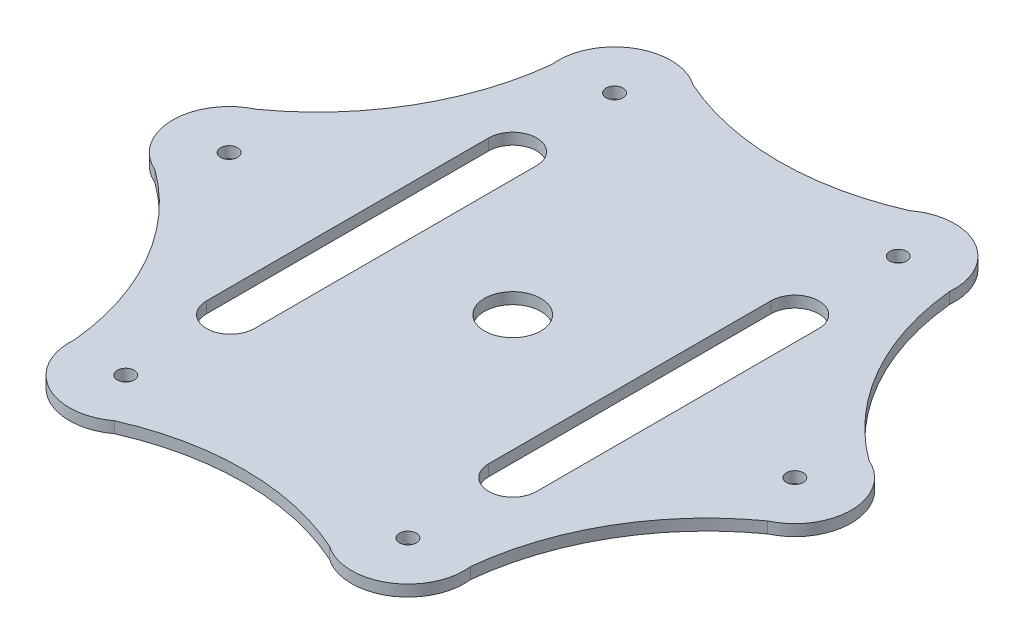
ISO-10303-21;
HEADER;
FILE_DESCRIPTION(('STEP AP214'),'2;1');
FILE_NAME('part.step','',(''),(''),'','','');
FILE_SCHEMA(('AUTOMOTIVE_DESIGN { 1 0 10303 214 1 1 1 1 }'));
ENDSEC;
DATA;
#1=APPLICATION_CONTEXT('core data for automotive mechanical design processes');
#2=APPLICATION_PROTOCOL_DEFINITION('international standard','automotive_design',2000,#1);
#3=PRODUCT_CONTEXT('',#1,'mechanical');
#4=PRODUCT('Part','Part','',(#3));
#5=PRODUCT_RELATED_PRODUCT_CATEGORY('part','',(#4));
#6=PRODUCT_DEFINITION_FORMATION('','',#4);
#7=PRODUCT_DEFINITION_CONTEXT('part definition',#1,'design');
#8=PRODUCT_DEFINITION('design','',#6,#7);
#9=PRODUCT_DEFINITION_SHAPE('','',#8);
#10=(LENGTH_UNIT() NAMED_UNIT(*) SI_UNIT(.MILLI.,.METRE.));
#11=(NAMED_UNIT(*) PLANE_ANGLE_UNIT() SI_UNIT($,.RADIAN.));
#12=(NAMED_UNIT(*) SI_UNIT($,.STERADIAN.) SOLID_ANGLE_UNIT());
#13=UNCERTAINTY_MEASURE_WITH_UNIT(LENGTH_MEASURE(1.E-05),#10,'distance_accuracy_value','');
#14=(GEOMETRIC_REPRESENTATION_CONTEXT(3) GLOBAL_UNCERTAINTY_ASSIGNED_CONTEXT((#13)) GLOBAL_UNIT_ASSIGNED_CONTEXT((#10,
#11,#12)) REPRESENTATION_CONTEXT('',''));
#15=CARTESIAN_POINT('',(0.,0.,0.));
#16=DIRECTION('',(0.,0.,1.));
#17=DIRECTION('',(1.,0.,0.));
#18=AXIS2_PLACEMENT_3D('',#15,#16,#17);
#19=CARTESIAN_POINT('',(-81.6112480416891,-2.,47.2721043024421));
#20=DIRECTION('',(0.,1.,0.));
#21=DIRECTION('',(0.,0.,1.));
#22=AXIS2_PLACEMENT_3D('',#19,#20,#21);
#23=CYLINDRICAL_SURFACE('',#22,46.8718791369647);
#24=CARTESIAN_POINT('',(-81.6112480416891,0.,47.2721043024421));
#25=DIRECTION('',(0.,-1.,0.));
#26=DIRECTION('',(0.,0.,-1.));
#27=AXIS2_PLACEMENT_3D('',#24,#25,#26);
#28=CIRCLE('',#27,46.8718791369647);
#29=CARTESIAN_POINT('',(-53.9349465475384,0.,9.44360460399912));
#30=VERTEX_POINT('',#29);
#31=CARTESIAN_POINT('',(-34.96376395523,0.,42.6911347288935));
#32=VERTEX_POINT('',#31);
#33=EDGE_CURVE('E278',#30,#32,#28,.T.);
#34=ORIENTED_EDGE('',*,*,#33,.F.);
#35=DIRECTION('',(0.,1.,0.));
#36=VECTOR('',#35,1.);
#37=CARTESIAN_POINT('',(-53.9349465475384,-2.,9.44360460399912));
#38=LINE('',#37,#36);
#39=CARTESIAN_POINT('',(-53.9349465475384,-2.,9.44360460399912));
#40=VERTEX_POINT('',#39);
#41=EDGE_CURVE('E11',#40,#30,#38,.T.);
#42=ORIENTED_EDGE('',*,*,#41,.F.);
#43=CARTESIAN_POINT('',(-81.6112480416891,-2.,47.2721043024421));
#44=DIRECTION('',(0.,-1.,0.));
#45=DIRECTION('',(0.,0.,-1.));
#46=AXIS2_PLACEMENT_3D('',#43,#44,#45);
#47=CIRCLE('',#46,46.8718791369647);
#48=CARTESIAN_POINT('',(-34.96376395523,-2.,42.6911347288935));
#49=VERTEX_POINT('',#48);
#50=EDGE_CURVE('E281',#40,#49,#47,.T.);
#51=ORIENTED_EDGE('',*,*,#50,.T.);
#52=DIRECTION('',(0.,1.,0.));
#53=VECTOR('',#52,1.);
#54=CARTESIAN_POINT('',(-34.96376395523,-2.,42.6911347288935));
#55=LINE('',#54,#53);
#56=EDGE_CURVE('E36',#49,#32,#55,.T.);
#57=ORIENTED_EDGE('',*,*,#56,.T.);
#58=EDGE_LOOP('',(#34,#42,#51,#57));
#59=FACE_BOUND('',#58,.T.);
#60=ADVANCED_FACE('F33',(#59),#23,.F.);
#61=CARTESIAN_POINT('',(-50.0008228466353,-2.,0.24998340743068));
#62=DIRECTION('',(0.,1.,0.));
#63=DIRECTION('',(0.,0.,1.));
#64=AXIS2_PLACEMENT_3D('',#61,#62,#63);
#65=CYLINDRICAL_SURFACE('',#64,10.);
#66=CARTESIAN_POINT('',(-50.0008228466353,0.,0.24998340743068));
#67=DIRECTION('',(0.,1.,0.));
#68=DIRECTION('',(0.,0.,1.));
#69=AXIS2_PLACEMENT_3D('',#66,#67,#68);
#70=CIRCLE('',#69,10.);
#71=CARTESIAN_POINT('',(-54.2374086111789,0.,-8.80823612290015));
#72=VERTEX_POINT('',#71);
#73=EDGE_CURVE('E285',#72,#30,#70,.T.);
#74=ORIENTED_EDGE('',*,*,#73,.F.);
#75=DIRECTION('',(0.,1.,0.));
#76=VECTOR('',#75,1.);
#77=CARTESIAN_POINT('',(-54.2374086111789,-2.,-8.80823612290015));
#78=LINE('',#77,#76);
#79=CARTESIAN_POINT('',(-54.2374086111789,-2.,-8.80823612290015));
#80=VERTEX_POINT('',#79);
#81=EDGE_CURVE('E41',#80,#72,#78,.T.);
#82=ORIENTED_EDGE('',*,*,#81,.F.);
#83=CARTESIAN_POINT('',(-50.0008228466353,-2.,0.24998340743068));
#84=DIRECTION('',(0.,1.,0.));
#85=DIRECTION('',(0.,0.,1.));
#86=AXIS2_PLACEMENT_3D('',#83,#84,#85);
#87=CIRCLE('',#86,10.);
#88=EDGE_CURVE('E315',#80,#40,#87,.T.);
#89=ORIENTED_EDGE('',*,*,#88,.T.);
#90=ORIENTED_EDGE('',*,*,#41,.T.);
#91=EDGE_LOOP('',(#74,#82,#89,#90));
#92=FACE_BOUND('',#91,.T.);
#93=ADVANCED_FACE('F382',(#92),#65,.T.);
#94=CARTESIAN_POINT('',(-81.5283866790652,-2.,-46.9156575776298));
#95=DIRECTION('',(0.,1.,0.));
#96=DIRECTION('',(0.,0.,1.));
#97=AXIS2_PLACEMENT_3D('',#94,#95,#96);
#98=CYLINDRICAL_SURFACE('',#97,46.8718791369648);
#99=CARTESIAN_POINT('',(-81.5283866790652,0.,-46.9156575776298));
#100=DIRECTION('',(0.,-1.,0.));
#101=DIRECTION('',(0.,0.,-1.));
#102=AXIS2_PLACEMENT_3D('',#99,#100,#101);
#103=CIRCLE('',#102,46.8718791369648);
#104=CARTESIAN_POINT('',(-34.9297942060862,0.,-41.8615272501195));
#105=VERTEX_POINT('',#104);
#106=EDGE_CURVE('E347',#105,#72,#103,.T.);
#107=ORIENTED_EDGE('',*,*,#106,.F.);
#108=DIRECTION('',(0.,1.,0.));
#109=VECTOR('',#108,1.);
#110=CARTESIAN_POINT('',(-34.9297942060862,-2.,-41.8615272501195));
#111=LINE('',#110,#109);
#112=CARTESIAN_POINT('',(-34.9297942060862,-2.,-41.8615272501195));
#113=VERTEX_POINT('',#112);
#114=EDGE_CURVE('E353',#113,#105,#111,.T.);
#115=ORIENTED_EDGE('',*,*,#114,.F.);
#116=CARTESIAN_POINT('',(-81.5283866790652,-2.,-46.9156575776298));
#117=DIRECTION('',(0.,-1.,0.));
#118=DIRECTION('',(0.,0.,-1.));
#119=AXIS2_PLACEMENT_3D('',#116,#117,#118);
#120=CIRCLE('',#119,46.8718791369648);
#121=EDGE_CURVE('E312',#113,#80,#120,.T.);
#122=ORIENTED_EDGE('',*,*,#121,.T.);
#123=ORIENTED_EDGE('',*,*,#81,.T.);
#124=EDGE_LOOP('',(#107,#115,#122,#123));
#125=FACE_BOUND('',#124,.T.);
#126=ADVANCED_FACE('F418',(#125),#98,.F.);
#127=CARTESIAN_POINT('',(-25.0008228466352,-2.,-43.0512867817912));
#128=DIRECTION('',(0.,1.,0.));
#129=DIRECTION('',(0.,0.,1.));
#130=AXIS2_PLACEMENT_3D('',#127,#128,#129);
#131=CYLINDRICAL_SURFACE('',#130,10.);
#132=CARTESIAN_POINT('',(-25.0008228466352,0.,-43.0512867817912));
#133=DIRECTION('',(0.,1.,0.));
#134=DIRECTION('',(0.,0.,1.));
#135=AXIS2_PLACEMENT_3D('',#132,#133,#134);
#136=CIRCLE('',#135,10.);
#137=CARTESIAN_POINT('',(-19.2744675025842,0.,-51.2493874443629));
#138=VERTEX_POINT('',#137);
#139=EDGE_CURVE('E344',#138,#105,#136,.T.);
#140=ORIENTED_EDGE('',*,*,#139,.F.);
#141=DIRECTION('',(0.,1.,0.));
#142=VECTOR('',#141,1.);
#143=CARTESIAN_POINT('',(-19.2744675025842,-2.,-51.2493874443629));
#144=LINE('',#143,#142);
#145=CARTESIAN_POINT('',(-19.2744675025842,-2.,-51.2493874443629));
#146=VERTEX_POINT('',#145);
#147=EDGE_CURVE('E355',#146,#138,#144,.T.);
#148=ORIENTED_EDGE('',*,*,#147,.F.);
#149=CARTESIAN_POINT('',(-25.0008228466352,-2.,-43.0512867817912));
#150=DIRECTION('',(0.,1.,0.));
#151=DIRECTION('',(0.,0.,1.));
#152=AXIS2_PLACEMENT_3D('',#149,#150,#151);
#153=CIRCLE('',#152,10.);
#154=EDGE_CURVE('E309',#146,#113,#153,.T.);
#155=ORIENTED_EDGE('',*,*,#154,.T.);
#156=ORIENTED_EDGE('',*,*,#114,.T.);
#157=EDGE_LOOP('',(#140,#148,#155,#156));
#158=FACE_BOUND('',#157,.T.);
#159=ADVANCED_FACE('F415',(#158),#131,.T.);
#160=CARTESIAN_POINT('',(0.0836842092592191,-2.,-94.4377452875027));
#161=DIRECTION('',(0.,1.,0.));
#162=DIRECTION('',(0.,0.,1.));
#163=AXIS2_PLACEMENT_3D('',#160,#161,#162);
#164=CYLINDRICAL_SURFACE('',#163,47.328345532945);
#165=CARTESIAN_POINT('',(0.0836842092592191,0.,-94.4377452875027));
#166=DIRECTION('',(0.,-1.,0.));
#167=DIRECTION('',(0.,0.,-1.));
#168=AXIS2_PLACEMENT_3D('',#165,#166,#167);
#169=CIRCLE('',#168,47.328345532945);
#170=CARTESIAN_POINT('',(19.1902517762217,0.,-51.1374985596267));
#171=VERTEX_POINT('',#170);
#172=EDGE_CURVE('E341',#171,#138,#169,.T.);
#173=ORIENTED_EDGE('',*,*,#172,.F.);
#174=DIRECTION('',(0.,1.,0.));
#175=VECTOR('',#174,1.);
#176=CARTESIAN_POINT('',(19.1902517762217,-2.,-51.1374985596267));
#177=LINE('',#176,#175);
#178=CARTESIAN_POINT('',(19.1902517762217,-2.,-51.1374985596267));
#179=VERTEX_POINT('',#178);
#180=EDGE_CURVE('E357',#179,#171,#177,.T.);
#181=ORIENTED_EDGE('',*,*,#180,.F.);
#182=CARTESIAN_POINT('',(0.0836842092592191,-2.,-94.4377452875027));
#183=DIRECTION('',(0.,-1.,0.));
#184=DIRECTION('',(0.,0.,-1.));
#185=AXIS2_PLACEMENT_3D('',#182,#183,#184);
#186=CIRCLE('',#185,47.328345532945);
#187=EDGE_CURVE('E306',#179,#146,#186,.T.);
#188=ORIENTED_EDGE('',*,*,#187,.T.);
#189=ORIENTED_EDGE('',*,*,#147,.T.);
#190=EDGE_LOOP('',(#173,#181,#188,#189));
#191=FACE_BOUND('',#190,.T.);
#192=ADVANCED_FACE('F412',(#191),#164,.F.);
#193=CARTESIAN_POINT('',(25.1850994347695,-2.,-43.1336368947299));
#194=DIRECTION('',(0.,1.,0.));
#195=DIRECTION('',(0.,0.,1.));
#196=AXIS2_PLACEMENT_3D('',#193,#194,#195);
#197=CYLINDRICAL_SURFACE('',#196,10.);
#198=CARTESIAN_POINT('',(25.1850994347695,0.,-43.1336368947299));
#199=DIRECTION('',(0.,1.,0.));
#200=DIRECTION('',(0.,0.,1.));
#201=AXIS2_PLACEMENT_3D('',#198,#199,#200);
#202=CIRCLE('',#201,10.);
#203=CARTESIAN_POINT('',(35.1480405433642,0.,-42.2735180269707));
#204=VERTEX_POINT('',#203);
#205=EDGE_CURVE('E338',#204,#171,#202,.T.);
#206=ORIENTED_EDGE('',*,*,#205,.F.);
#207=DIRECTION('',(0.,1.,0.));
#208=VECTOR('',#207,1.);
#209=CARTESIAN_POINT('',(35.1480405433642,-2.,-42.2735180269707));
#210=LINE('',#209,#208);
#211=CARTESIAN_POINT('',(35.1480405433642,-2.,-42.2735180269707));
#212=VERTEX_POINT('',#211);
#213=EDGE_CURVE('E359',#212,#204,#210,.T.);
#214=ORIENTED_EDGE('',*,*,#213,.F.);
#215=CARTESIAN_POINT('',(25.1850994347695,-2.,-43.1336368947299));
#216=DIRECTION('',(0.,1.,0.));
#217=DIRECTION('',(0.,0.,1.));
#218=AXIS2_PLACEMENT_3D('',#215,#216,#217);
#219=CIRCLE('',#218,10.);
#220=EDGE_CURVE('E303',#212,#179,#219,.T.);
#221=ORIENTED_EDGE('',*,*,#220,.T.);
#222=ORIENTED_EDGE('',*,*,#180,.T.);
#223=EDGE_LOOP('',(#206,#214,#221,#222));
#224=FACE_BOUND('',#223,.T.);
#225=ADVANCED_FACE('F408',(#224),#197,.T.);
#226=CARTESIAN_POINT('',(81.7921743440668,-2.,-46.8884758612725));
#227=DIRECTION('',(0.,1.,0.));
#228=DIRECTION('',(0.,0.,1.));
#229=AXIS2_PLACEMENT_3D('',#226,#227,#228);
#230=CYLINDRICAL_SURFACE('',#229,46.8718791369648);
#231=CARTESIAN_POINT('',(81.7921743440668,0.,-46.8884758612725));
#232=DIRECTION('',(0.,-1.,0.));
#233=DIRECTION('',(0.,0.,-1.));
#234=AXIS2_PLACEMENT_3D('',#231,#232,#233);
#235=CIRCLE('',#234,46.8718791369648);
#236=CARTESIAN_POINT('',(53.9341237009031,0.,-9.19362119656846));
#237=VERTEX_POINT('',#236);
#238=EDGE_CURVE('E335',#237,#204,#235,.T.);
#239=ORIENTED_EDGE('',*,*,#238,.F.);
#240=DIRECTION('',(0.,1.,0.));
#241=VECTOR('',#240,1.);
#242=CARTESIAN_POINT('',(53.9341237009031,-2.,-9.19362119656846));
#243=LINE('',#242,#241);
#244=CARTESIAN_POINT('',(53.9341237009031,-2.,-9.19362119656846));
#245=VERTEX_POINT('',#244);
#246=EDGE_CURVE('E361',#245,#237,#243,.T.);
#247=ORIENTED_EDGE('',*,*,#246,.F.);
#248=CARTESIAN_POINT('',(81.7921743440668,-2.,-46.8884758612725));
#249=DIRECTION('',(0.,-1.,0.));
#250=DIRECTION('',(0.,0.,-1.));
#251=AXIS2_PLACEMENT_3D('',#248,#249,#250);
#252=CIRCLE('',#251,46.8718791369648);
#253=EDGE_CURVE('E300',#245,#212,#252,.T.);
#254=ORIENTED_EDGE('',*,*,#253,.T.);
#255=ORIENTED_EDGE('',*,*,#213,.T.);
#256=EDGE_LOOP('',(#239,#247,#254,#255));
#257=FACE_BOUND('',#256,.T.);
#258=ADVANCED_FACE('F404',(#257),#230,.F.);
#259=CARTESIAN_POINT('',(50.,-2.,0.));
#260=DIRECTION('',(0.,1.,0.));
#261=DIRECTION('',(0.,0.,1.));
#262=AXIS2_PLACEMENT_3D('',#259,#260,#261);
#263=CYLINDRICAL_SURFACE('',#262,10.);
#264=CARTESIAN_POINT('',(50.,0.,0.));
#265=DIRECTION('',(0.,1.,0.));
#266=DIRECTION('',(0.,0.,1.));
#267=AXIS2_PLACEMENT_3D('',#264,#265,#266);
#268=CIRCLE('',#267,10.);
#269=CARTESIAN_POINT('',(54.2365857645437,0.,9.05821953033081));
#270=VERTEX_POINT('',#269);
#271=EDGE_CURVE('E332',#270,#237,#268,.T.);
#272=ORIENTED_EDGE('',*,*,#271,.F.);
#273=DIRECTION('',(0.,1.,0.));
#274=VECTOR('',#273,1.);
#275=CARTESIAN_POINT('',(54.2365857645437,-2.,9.05821953033081));
#276=LINE('',#275,#274);
#277=CARTESIAN_POINT('',(54.2365857645437,-2.,9.05821953033081));
#278=VERTEX_POINT('',#277);
#279=EDGE_CURVE('E363',#278,#270,#276,.T.);
#280=ORIENTED_EDGE('',*,*,#279,.F.);
#281=CARTESIAN_POINT('',(50.,-2.,0.));
#282=DIRECTION('',(0.,1.,0.));
#283=DIRECTION('',(0.,0.,1.));
#284=AXIS2_PLACEMENT_3D('',#281,#282,#283);
#285=CIRCLE('',#284,10.);
#286=EDGE_CURVE('E297',#278,#245,#285,.T.);
#287=ORIENTED_EDGE('',*,*,#286,.T.);
#288=ORIENTED_EDGE('',*,*,#246,.T.);
#289=EDGE_LOOP('',(#272,#280,#287,#288));
#290=FACE_BOUND('',#289,.T.);
#291=ADVANCED_FACE('F400',(#290),#263,.T.);
#292=CARTESIAN_POINT('',(81.5552140705727,-2.,47.1458238302505));
#293=DIRECTION('',(0.,1.,0.));
#294=DIRECTION('',(0.,0.,1.));
#295=AXIS2_PLACEMENT_3D('',#292,#293,#294);
#296=CYLINDRICAL_SURFACE('',#295,46.8718791369647);
#297=CARTESIAN_POINT('',(81.5552140705727,0.,47.1458238302505));
#298=DIRECTION('',(0.,-1.,0.));
#299=DIRECTION('',(0.,0.,-1.));
#300=AXIS2_PLACEMENT_3D('',#297,#298,#299);
#301=CIRCLE('',#300,46.8718791369647);
#302=CARTESIAN_POINT('',(34.9281485128155,0.,42.3614940649809));
#303=VERTEX_POINT('',#302);
#304=EDGE_CURVE('E329',#303,#270,#301,.T.);
#305=ORIENTED_EDGE('',*,*,#304,.F.);
#306=DIRECTION('',(0.,1.,0.));
#307=VECTOR('',#306,1.);
#308=CARTESIAN_POINT('',(34.9281485128155,-2.,42.3614940649809));
#309=LINE('',#308,#307);
#310=CARTESIAN_POINT('',(34.9281485128155,-2.,42.3614940649809));
#311=VERTEX_POINT('',#310);
#312=EDGE_CURVE('E365',#311,#303,#309,.T.);
#313=ORIENTED_EDGE('',*,*,#312,.F.);
#314=CARTESIAN_POINT('',(81.5552140705727,-2.,47.1458238302505));
#315=DIRECTION('',(0.,-1.,0.));
#316=DIRECTION('',(0.,0.,-1.));
#317=AXIS2_PLACEMENT_3D('',#314,#315,#316);
#318=CIRCLE('',#317,46.8718791369647);
#319=EDGE_CURVE('E294',#311,#278,#318,.T.);
#320=ORIENTED_EDGE('',*,*,#319,.T.);
#321=ORIENTED_EDGE('',*,*,#279,.T.);
#322=EDGE_LOOP('',(#305,#313,#320,#321));
#323=FACE_BOUND('',#322,.T.);
#324=ADVANCED_FACE('F396',(#323),#296,.F.);
#325=CARTESIAN_POINT('',(24.9991771533646,-2.,43.5512535966527));
#326=DIRECTION('',(0.,1.,0.));
#327=DIRECTION('',(0.,0.,1.));
#328=AXIS2_PLACEMENT_3D('',#325,#326,#327);
#329=CYLINDRICAL_SURFACE('',#328,10.);
#330=CARTESIAN_POINT('',(24.9991771533646,0.,43.5512535966527));
#331=DIRECTION('',(0.,1.,0.));
#332=DIRECTION('',(0.,0.,1.));
#333=AXIS2_PLACEMENT_3D('',#330,#331,#332);
#334=CIRCLE('',#333,10.);
#335=CARTESIAN_POINT('',(19.2728218093136,0.,51.7493542592244));
#336=VERTEX_POINT('',#335);
#337=EDGE_CURVE('E326',#336,#303,#334,.T.);
#338=ORIENTED_EDGE('',*,*,#337,.F.);
#339=DIRECTION('',(0.,1.,0.));
#340=VECTOR('',#339,1.);
#341=CARTESIAN_POINT('',(19.2728218093136,-2.,51.7493542592244));
#342=LINE('',#341,#340);
#343=CARTESIAN_POINT('',(19.2728218093136,-2.,51.7493542592244));
#344=VERTEX_POINT('',#343);
#345=EDGE_CURVE('E367',#344,#336,#342,.T.);
#346=ORIENTED_EDGE('',*,*,#345,.F.);
#347=CARTESIAN_POINT('',(24.9991771533646,-2.,43.5512535966527));
#348=DIRECTION('',(0.,1.,0.));
#349=DIRECTION('',(0.,0.,1.));
#350=AXIS2_PLACEMENT_3D('',#347,#348,#349);
#351=CIRCLE('',#350,10.);
#352=EDGE_CURVE('E291',#344,#311,#351,.T.);
#353=ORIENTED_EDGE('',*,*,#352,.T.);
#354=ORIENTED_EDGE('',*,*,#312,.T.);
#355=EDGE_LOOP('',(#338,#346,#353,#354));
#356=FACE_BOUND('',#355,.T.);
#357=ADVANCED_FACE('F394',(#356),#329,.T.);
#358=CARTESIAN_POINT('',(-0.0836842092592519,-2.,94.4377452875026));
#359=DIRECTION('',(0.,1.,0.));
#360=DIRECTION('',(0.,0.,1.));
#361=AXIS2_PLACEMENT_3D('',#358,#359,#360);
#362=CYLINDRICAL_SURFACE('',#361,46.8718791369647);
#363=CARTESIAN_POINT('',(-0.0836842092592519,0.,94.4377452875026));
#364=DIRECTION('',(0.,-1.,0.));
#365=DIRECTION('',(0.,0.,-1.));
#366=AXIS2_PLACEMENT_3D('',#363,#364,#365);
#367=CIRCLE('',#366,46.8718791369647);
#368=CARTESIAN_POINT('',(-19.0059751880876,0.,51.5551152615494));
#369=VERTEX_POINT('',#368);
#370=EDGE_CURVE('E323',#369,#336,#367,.T.);
#371=ORIENTED_EDGE('',*,*,#370,.F.);
#372=DIRECTION('',(0.,1.,0.));
#373=VECTOR('',#372,1.);
#374=CARTESIAN_POINT('',(-19.0059751880876,-2.,51.5551152615494));
#375=LINE('',#374,#373);
#376=CARTESIAN_POINT('',(-19.0059751880876,-2.,51.5551152615494));
#377=VERTEX_POINT('',#376);
#378=EDGE_CURVE('E368',#377,#369,#375,.T.);
#379=ORIENTED_EDGE('',*,*,#378,.F.);
#380=CARTESIAN_POINT('',(-0.0836842092592519,-2.,94.4377452875026));
#381=DIRECTION('',(0.,-1.,0.));
#382=DIRECTION('',(0.,0.,-1.));
#383=AXIS2_PLACEMENT_3D('',#380,#381,#382);
#384=CIRCLE('',#383,46.8718791369647);
#385=EDGE_CURVE('E288',#377,#344,#384,.T.);
#386=ORIENTED_EDGE('',*,*,#385,.T.);
#387=ORIENTED_EDGE('',*,*,#345,.T.);
#388=EDGE_LOOP('',(#371,#379,#386,#387));
#389=FACE_BOUND('',#388,.T.);
#390=ADVANCED_FACE('F390',(#389),#362,.F.);
#391=CARTESIAN_POINT('',(-25.0008228466354,-2.,43.5512535966526));
#392=DIRECTION('',(0.,1.,0.));
#393=DIRECTION('',(0.,0.,1.));
#394=AXIS2_PLACEMENT_3D('',#391,#392,#393);
#395=CYLINDRICAL_SURFACE('',#394,10.);
#396=CARTESIAN_POINT('',(-25.0008228466354,0.,43.5512535966526));
#397=DIRECTION('',(0.,1.,0.));
#398=DIRECTION('',(0.,0.,1.));
#399=AXIS2_PLACEMENT_3D('',#396,#397,#398);
#400=CIRCLE('',#399,10.);
#401=EDGE_CURVE('E320',#32,#369,#400,.T.);
#402=ORIENTED_EDGE('',*,*,#401,.F.);
#403=ORIENTED_EDGE('',*,*,#56,.F.);
#404=CARTESIAN_POINT('',(-25.0008228466354,-2.,43.5512535966526));
#405=DIRECTION('',(0.,1.,0.));
#406=DIRECTION('',(0.,0.,1.));
#407=AXIS2_PLACEMENT_3D('',#404,#405,#406);
#408=CIRCLE('',#407,10.);
#409=EDGE_CURVE('E284',#49,#377,#408,.T.);
#410=ORIENTED_EDGE('',*,*,#409,.T.);
#411=ORIENTED_EDGE('',*,*,#378,.T.);
#412=EDGE_LOOP('',(#402,#403,#410,#411));
#413=FACE_BOUND('',#412,.T.);
#414=ADVANCED_FACE('F376',(#413),#395,.T.);
#415=CARTESIAN_POINT('',(-53.3060354441622,-2.,45.4116789495474));
#416=DIRECTION('',(0.,-1.,0.));
#417=DIRECTION('',(0.,0.,-1.));
#418=AXIS2_PLACEMENT_3D('',#415,#416,#417);
#419=PLANE('',#418);
#420=CARTESIAN_POINT('',(0.,-2.,0.));
#421=DIRECTION('',(0.,1.,0.));
#422=DIRECTION('',(0.,0.,1.));
#423=AXIS2_PLACEMENT_3D('',#420,#421,#422);
#424=CIRCLE('',#423,5.);
#425=CARTESIAN_POINT('',(0.,-2.,5.));
#426=VERTEX_POINT('',#425);
#427=EDGE_CURVE('E230',#426,#426,#424,.T.);
#428=ORIENTED_EDGE('',*,*,#427,.T.);
#429=EDGE_LOOP('',(#428));
#430=FACE_BOUND('',#429,.T.);
#431=CARTESIAN_POINT('',(-25.,-2.,-25.));
#432=DIRECTION('',(0.,1.,0.));
#433=DIRECTION('',(0.,0.,1.));
#434=AXIS2_PLACEMENT_3D('',#431,#432,#433);
#435=CIRCLE('',#434,4.24999999999999);
#436=CARTESIAN_POINT('',(-20.75,-2.,-25.));
#437=VERTEX_POINT('',#436);
#438=CARTESIAN_POINT('',(-29.25,-2.,-25.));
#439=VERTEX_POINT('',#438);
#440=EDGE_CURVE('E174',#437,#439,#435,.T.);
#441=ORIENTED_EDGE('',*,*,#440,.T.);
#442=DIRECTION('',(0.,0.,1.));
#443=VECTOR('',#442,1.);
#444=CARTESIAN_POINT('',(-29.25,-2.,-25.));
#445=LINE('',#444,#443);
#446=CARTESIAN_POINT('',(-29.25,-2.,25.));
#447=VERTEX_POINT('',#446);
#448=EDGE_CURVE('E185',#439,#447,#445,.T.);
#449=ORIENTED_EDGE('',*,*,#448,.T.);
#450=CARTESIAN_POINT('',(-25.,-2.,25.));
#451=DIRECTION('',(0.,1.,0.));
#452=DIRECTION('',(0.,0.,1.));
#453=AXIS2_PLACEMENT_3D('',#450,#451,#452);
#454=CIRCLE('',#453,4.24999999999999);
#455=CARTESIAN_POINT('',(-20.75,-2.,25.));
#456=VERTEX_POINT('',#455);
#457=EDGE_CURVE('E49',#447,#456,#454,.T.);
#458=ORIENTED_EDGE('',*,*,#457,.T.);
#459=DIRECTION('',(0.,0.,-1.));
#460=VECTOR('',#459,1.);
#461=CARTESIAN_POINT('',(-20.75,-2.,-25.));
#462=LINE('',#461,#460);
#463=EDGE_CURVE('E182',#456,#437,#462,.T.);
#464=ORIENTED_EDGE('',*,*,#463,.T.);
#465=EDGE_LOOP('',(#441,#449,#458,#464));
#466=FACE_BOUND('',#465,.T.);
#467=CARTESIAN_POINT('',(25.,-2.,-25.));
#468=DIRECTION('',(0.,1.,0.));
#469=DIRECTION('',(0.,0.,-1.));
#470=AXIS2_PLACEMENT_3D('',#467,#468,#469);
#471=CIRCLE('',#470,4.24999999999999);
#472=CARTESIAN_POINT('',(29.25,-2.,-25.));
#473=VERTEX_POINT('',#472);
#474=CARTESIAN_POINT('',(20.75,-2.,-25.));
#475=VERTEX_POINT('',#474);
#476=EDGE_CURVE('E215',#473,#475,#471,.T.);
#477=ORIENTED_EDGE('',*,*,#476,.T.);
#478=DIRECTION('',(0.,0.,1.));
#479=VECTOR('',#478,1.);
#480=CARTESIAN_POINT('',(20.75,-2.,-25.));
#481=LINE('',#480,#479);
#482=CARTESIAN_POINT('',(20.75,-2.,25.));
#483=VERTEX_POINT('',#482);
#484=EDGE_CURVE('E218',#475,#483,#481,.T.);
#485=ORIENTED_EDGE('',*,*,#484,.T.);
#486=CARTESIAN_POINT('',(25.,-2.,25.));
#487=DIRECTION('',(0.,1.,0.));
#488=DIRECTION('',(0.,0.,-1.));
#489=AXIS2_PLACEMENT_3D('',#486,#487,#488);
#490=CIRCLE('',#489,4.24999999999999);
#491=CARTESIAN_POINT('',(29.25,-2.,25.));
#492=VERTEX_POINT('',#491);
#493=EDGE_CURVE('E57',#483,#492,#490,.T.);
#494=ORIENTED_EDGE('',*,*,#493,.T.);
#495=DIRECTION('',(0.,0.,-1.));
#496=VECTOR('',#495,1.);
#497=CARTESIAN_POINT('',(29.25,-2.,-25.));
#498=LINE('',#497,#496);
#499=EDGE_CURVE('E223',#492,#473,#498,.T.);
#500=ORIENTED_EDGE('',*,*,#499,.T.);
#501=EDGE_LOOP('',(#477,#485,#494,#500));
#502=FACE_BOUND('',#501,.T.);
#503=CARTESIAN_POINT('',(-25.0008228466352,-2.,-43.0512867817912));
#504=DIRECTION('',(0.,1.,0.));
#505=DIRECTION('',(0.,0.,-1.));
#506=AXIS2_PLACEMENT_3D('',#503,#504,#505);
#507=CIRCLE('',#506,1.5);
#508=CARTESIAN_POINT('',(-25.0008228466352,-2.,-44.5512867817912));
#509=VERTEX_POINT('',#508);
#510=EDGE_CURVE('E245',#509,#509,#507,.T.);
#511=ORIENTED_EDGE('',*,*,#510,.T.);
#512=EDGE_LOOP('',(#511));
#513=FACE_BOUND('',#512,.T.);
#514=CARTESIAN_POINT('',(-50.0008228466353,-2.,0.24998340743068));
#515=DIRECTION('',(0.,1.,0.));
#516=DIRECTION('',(0.,0.,-1.));
#517=AXIS2_PLACEMENT_3D('',#514,#515,#516);
#518=CIRCLE('',#517,1.5);
#519=CARTESIAN_POINT('',(-50.0008228466353,-2.,-1.25001659256932));
#520=VERTEX_POINT('',#519);
#521=EDGE_CURVE('E251',#520,#520,#518,.T.);
#522=ORIENTED_EDGE('',*,*,#521,.T.);
#523=EDGE_LOOP('',(#522));
#524=FACE_BOUND('',#523,.T.);
#525=CARTESIAN_POINT('',(-25.0008228466354,-2.,43.5512535966526));
#526=DIRECTION('',(0.,1.,0.));
#527=DIRECTION('',(0.,0.,-1.));
#528=AXIS2_PLACEMENT_3D('',#525,#526,#527);
#529=CIRCLE('',#528,1.5);
#530=CARTESIAN_POINT('',(-25.0008228466354,-2.,42.0512535966526));
#531=VERTEX_POINT('',#530);
#532=EDGE_CURVE('E257',#531,#531,#529,.T.);
#533=ORIENTED_EDGE('',*,*,#532,.T.);
#534=EDGE_LOOP('',(#533));
#535=FACE_BOUND('',#534,.T.);
#536=CARTESIAN_POINT('',(25.1850994347695,-2.,-43.1336368947299));
#537=DIRECTION('',(0.,1.,0.));
#538=DIRECTION('',(0.,0.,-1.));
#539=AXIS2_PLACEMENT_3D('',#536,#537,#538);
#540=CIRCLE('',#539,1.5);
#541=CARTESIAN_POINT('',(25.1850994347695,-2.,-44.6336368947299));
#542=VERTEX_POINT('',#541);
#543=EDGE_CURVE('E263',#542,#542,#540,.T.);
#544=ORIENTED_EDGE('',*,*,#543,.T.);
#545=EDGE_LOOP('',(#544));
#546=FACE_BOUND('',#545,.T.);
#547=CARTESIAN_POINT('',(24.9991771533646,-2.,43.5512535966527));
#548=DIRECTION('',(0.,1.,0.));
#549=DIRECTION('',(0.,0.,-1.));
#550=AXIS2_PLACEMENT_3D('',#547,#548,#549);
#551=CIRCLE('',#550,1.5);
#552=CARTESIAN_POINT('',(24.9991771533646,-2.,42.0512535966527));
#553=VERTEX_POINT('',#552);
#554=EDGE_CURVE('E269',#553,#553,#551,.T.);
#555=ORIENTED_EDGE('',*,*,#554,.T.);
#556=EDGE_LOOP('',(#555));
#557=FACE_BOUND('',#556,.T.);
#558=CARTESIAN_POINT('',(50.,-2.,0.));
#559=DIRECTION('',(0.,1.,0.));
#560=DIRECTION('',(0.,0.,-1.));
#561=AXIS2_PLACEMENT_3D('',#558,#559,#560);
#562=CIRCLE('',#561,1.5);
#563=CARTESIAN_POINT('',(50.,-2.,-1.5));
#564=VERTEX_POINT('',#563);
#565=EDGE_CURVE('E275',#564,#564,#562,.T.);
#566=ORIENTED_EDGE('',*,*,#565,.T.);
#567=EDGE_LOOP('',(#566));
#568=FACE_BOUND('',#567,.T.);
#569=ORIENTED_EDGE('',*,*,#50,.F.);
#570=ORIENTED_EDGE('',*,*,#88,.F.);
#571=ORIENTED_EDGE('',*,*,#121,.F.);
#572=ORIENTED_EDGE('',*,*,#154,.F.);
#573=ORIENTED_EDGE('',*,*,#187,.F.);
#574=ORIENTED_EDGE('',*,*,#220,.F.);
#575=ORIENTED_EDGE('',*,*,#253,.F.);
#576=ORIENTED_EDGE('',*,*,#286,.F.);
#577=ORIENTED_EDGE('',*,*,#319,.F.);
#578=ORIENTED_EDGE('',*,*,#352,.F.);
#579=ORIENTED_EDGE('',*,*,#385,.F.);
#580=ORIENTED_EDGE('',*,*,#409,.F.);
#581=EDGE_LOOP('',(#569,#570,#571,#572,#573,#574,#575,#576,#577,#578,#579,#580));
#582=FACE_BOUND('',#581,.T.);
#583=ADVANCED_FACE('F189',(#430,#466,#502,#513,#524,#535,#546,#557,#568,#582),#419,.T.);
#584=CARTESIAN_POINT('',(-53.3060354441622,0.,45.4116789495474));
#585=DIRECTION('',(0.,-1.,0.));
#586=DIRECTION('',(0.,0.,-1.));
#587=AXIS2_PLACEMENT_3D('',#584,#585,#586);
#588=PLANE('',#587);
#589=CARTESIAN_POINT('',(0.,0.,0.));
#590=DIRECTION('',(0.,1.,0.));
#591=DIRECTION('',(0.,0.,1.));
#592=AXIS2_PLACEMENT_3D('',#589,#590,#591);
#593=CIRCLE('',#592,5.);
#594=CARTESIAN_POINT('',(0.,0.,5.));
#595=VERTEX_POINT('',#594);
#596=EDGE_CURVE('E198',#595,#595,#593,.T.);
#597=ORIENTED_EDGE('',*,*,#596,.F.);
#598=EDGE_LOOP('',(#597));
#599=FACE_BOUND('',#598,.T.);
#600=DIRECTION('',(0.,0.,1.));
#601=VECTOR('',#600,1.);
#602=CARTESIAN_POINT('',(-29.25,0.,-25.));
#603=LINE('',#602,#601);
#604=CARTESIAN_POINT('',(-29.25,0.,-25.));
#605=VERTEX_POINT('',#604);
#606=CARTESIAN_POINT('',(-29.25,0.,25.));
#607=VERTEX_POINT('',#606);
#608=EDGE_CURVE('E204',#605,#607,#603,.T.);
#609=ORIENTED_EDGE('',*,*,#608,.F.);
#610=CARTESIAN_POINT('',(-25.,0.,-25.));
#611=DIRECTION('',(0.,1.,0.));
#612=DIRECTION('',(0.,0.,1.));
#613=AXIS2_PLACEMENT_3D('',#610,#611,#612);
#614=CIRCLE('',#613,4.24999999999999);
#615=CARTESIAN_POINT('',(-20.75,0.,-25.));
#616=VERTEX_POINT('',#615);
#617=EDGE_CURVE('E177',#616,#605,#614,.T.);
#618=ORIENTED_EDGE('',*,*,#617,.F.);
#619=DIRECTION('',(0.,0.,-1.));
#620=VECTOR('',#619,1.);
#621=CARTESIAN_POINT('',(-20.75,0.,-25.));
#622=LINE('',#621,#620);
#623=CARTESIAN_POINT('',(-20.75,0.,25.));
#624=VERTEX_POINT('',#623);
#625=EDGE_CURVE('E192',#624,#616,#622,.T.);
#626=ORIENTED_EDGE('',*,*,#625,.F.);
#627=CARTESIAN_POINT('',(-25.,0.,25.));
#628=DIRECTION('',(0.,1.,0.));
#629=DIRECTION('',(0.,0.,1.));
#630=AXIS2_PLACEMENT_3D('',#627,#628,#629);
#631=CIRCLE('',#630,4.24999999999999);
#632=EDGE_CURVE('E195',#607,#624,#631,.T.);
#633=ORIENTED_EDGE('',*,*,#632,.F.);
#634=EDGE_LOOP('',(#609,#618,#626,#633));
#635=FACE_BOUND('',#634,.T.);
#636=DIRECTION('',(0.,0.,1.));
#637=VECTOR('',#636,1.);
#638=CARTESIAN_POINT('',(20.75,0.,-25.));
#639=LINE('',#638,#637);
#640=CARTESIAN_POINT('',(20.75,0.,-25.));
#641=VERTEX_POINT('',#640);
#642=CARTESIAN_POINT('',(20.75,0.,25.));
#643=VERTEX_POINT('',#642);
#644=EDGE_CURVE('E229',#641,#643,#639,.T.);
#645=ORIENTED_EDGE('',*,*,#644,.F.);
#646=CARTESIAN_POINT('',(25.,0.,-25.));
#647=DIRECTION('',(0.,1.,0.));
#648=DIRECTION('',(0.,0.,-1.));
#649=AXIS2_PLACEMENT_3D('',#646,#647,#648);
#650=CIRCLE('',#649,4.24999999999999);
#651=CARTESIAN_POINT('',(29.25,0.,-25.));
#652=VERTEX_POINT('',#651);
#653=EDGE_CURVE('E227',#652,#641,#650,.T.);
#654=ORIENTED_EDGE('',*,*,#653,.F.);
#655=DIRECTION('',(0.,0.,-1.));
#656=VECTOR('',#655,1.);
#657=CARTESIAN_POINT('',(29.25,0.,-25.));
#658=LINE('',#657,#656);
#659=CARTESIAN_POINT('',(29.25,0.,25.));
#660=VERTEX_POINT('',#659);
#661=EDGE_CURVE('E219',#660,#652,#658,.T.);
#662=ORIENTED_EDGE('',*,*,#661,.F.);
#663=CARTESIAN_POINT('',(25.,0.,25.));
#664=DIRECTION('',(0.,1.,0.));
#665=DIRECTION('',(0.,0.,-1.));
#666=AXIS2_PLACEMENT_3D('',#663,#664,#665);
#667=CIRCLE('',#666,4.24999999999999);
#668=EDGE_CURVE('E233',#643,#660,#667,.T.);
#669=ORIENTED_EDGE('',*,*,#668,.F.);
#670=EDGE_LOOP('',(#645,#654,#662,#669));
#671=FACE_BOUND('',#670,.T.);
#672=CARTESIAN_POINT('',(-25.0008228466352,0.,-43.0512867817912));
#673=DIRECTION('',(0.,1.,0.));
#674=DIRECTION('',(0.,0.,-1.));
#675=AXIS2_PLACEMENT_3D('',#672,#673,#674);
#676=CIRCLE('',#675,1.5);
#677=CARTESIAN_POINT('',(-25.0008228466352,0.,-44.5512867817912));
#678=VERTEX_POINT('',#677);
#679=EDGE_CURVE('E211',#678,#678,#676,.T.);
#680=ORIENTED_EDGE('',*,*,#679,.F.);
#681=EDGE_LOOP('',(#680));
#682=FACE_BOUND('',#681,.T.);
#683=CARTESIAN_POINT('',(-50.0008228466353,0.,0.24998340743068));
#684=DIRECTION('',(0.,1.,0.));
#685=DIRECTION('',(0.,0.,-1.));
#686=AXIS2_PLACEMENT_3D('',#683,#684,#685);
#687=CIRCLE('',#686,1.5);
#688=CARTESIAN_POINT('',(-50.0008228466353,0.,-1.25001659256932));
#689=VERTEX_POINT('',#688);
#690=EDGE_CURVE('E248',#689,#689,#687,.T.);
#691=ORIENTED_EDGE('',*,*,#690,.F.);
#692=EDGE_LOOP('',(#691));
#693=FACE_BOUND('',#692,.T.);
#694=CARTESIAN_POINT('',(-25.0008228466354,0.,43.5512535966526));
#695=DIRECTION('',(0.,1.,0.));
#696=DIRECTION('',(0.,0.,-1.));
#697=AXIS2_PLACEMENT_3D('',#694,#695,#696);
#698=CIRCLE('',#697,1.5);
#699=CARTESIAN_POINT('',(-25.0008228466354,0.,42.0512535966526));
#700=VERTEX_POINT('',#699);
#701=EDGE_CURVE('E254',#700,#700,#698,.T.);
#702=ORIENTED_EDGE('',*,*,#701,.F.);
#703=EDGE_LOOP('',(#702));
#704=FACE_BOUND('',#703,.T.);
#705=CARTESIAN_POINT('',(25.1850994347695,0.,-43.1336368947299));
#706=DIRECTION('',(0.,1.,0.));
#707=DIRECTION('',(0.,0.,-1.));
#708=AXIS2_PLACEMENT_3D('',#705,#706,#707);
#709=CIRCLE('',#708,1.5);
#710=CARTESIAN_POINT('',(25.1850994347695,0.,-44.6336368947299));
#711=VERTEX_POINT('',#710);
#712=EDGE_CURVE('E260',#711,#711,#709,.T.);
#713=ORIENTED_EDGE('',*,*,#712,.F.);
#714=EDGE_LOOP('',(#713));
#715=FACE_BOUND('',#714,.T.);
#716=CARTESIAN_POINT('',(24.9991771533646,0.,43.5512535966527));
#717=DIRECTION('',(0.,1.,0.));
#718=DIRECTION('',(0.,0.,-1.));
#719=AXIS2_PLACEMENT_3D('',#716,#717,#718);
#720=CIRCLE('',#719,1.5);
#721=CARTESIAN_POINT('',(24.9991771533646,0.,42.0512535966527));
#722=VERTEX_POINT('',#721);
#723=EDGE_CURVE('E266',#722,#722,#720,.T.);
#724=ORIENTED_EDGE('',*,*,#723,.F.);
#725=EDGE_LOOP('',(#724));
#726=FACE_BOUND('',#725,.T.);
#727=CARTESIAN_POINT('',(50.,0.,0.));
#728=DIRECTION('',(0.,1.,0.));
#729=DIRECTION('',(0.,0.,-1.));
#730=AXIS2_PLACEMENT_3D('',#727,#728,#729);
#731=CIRCLE('',#730,1.5);
#732=CARTESIAN_POINT('',(50.,0.,-1.5));
#733=VERTEX_POINT('',#732);
#734=EDGE_CURVE('E272',#733,#733,#731,.T.);
#735=ORIENTED_EDGE('',*,*,#734,.F.);
#736=EDGE_LOOP('',(#735));
#737=FACE_BOUND('',#736,.T.);
#738=ORIENTED_EDGE('',*,*,#33,.T.);
#739=ORIENTED_EDGE('',*,*,#401,.T.);
#740=ORIENTED_EDGE('',*,*,#370,.T.);
#741=ORIENTED_EDGE('',*,*,#337,.T.);
#742=ORIENTED_EDGE('',*,*,#304,.T.);
#743=ORIENTED_EDGE('',*,*,#271,.T.);
#744=ORIENTED_EDGE('',*,*,#238,.T.);
#745=ORIENTED_EDGE('',*,*,#205,.T.);
#746=ORIENTED_EDGE('',*,*,#172,.T.);
#747=ORIENTED_EDGE('',*,*,#139,.T.);
#748=ORIENTED_EDGE('',*,*,#106,.T.);
#749=ORIENTED_EDGE('',*,*,#73,.T.);
#750=EDGE_LOOP('',(#738,#739,#740,#741,#742,#743,#744,#745,#746,#747,#748,#749));
#751=FACE_BOUND('',#750,.T.);
#752=ADVANCED_FACE('F378',(#599,#635,#671,#682,#693,#704,#715,#726,#737,#751),#588,.F.);
#753=CARTESIAN_POINT('',(50.,-2.,0.));
#754=DIRECTION('',(0.,1.,0.));
#755=DIRECTION('',(0.,0.,1.));
#756=AXIS2_PLACEMENT_3D('',#753,#754,#755);
#757=CYLINDRICAL_SURFACE('',#756,1.5);
#758=ORIENTED_EDGE('',*,*,#565,.F.);
#759=EDGE_LOOP('',(#758));
#760=FACE_BOUND('',#759,.T.);
#761=ORIENTED_EDGE('',*,*,#734,.T.);
#762=EDGE_LOOP('',(#761));
#763=FACE_BOUND('',#762,.T.);
#764=ADVANCED_FACE('F514',(#760,#763),#757,.F.);
#765=CARTESIAN_POINT('',(24.9991771533646,-2.,43.5512535966527));
#766=DIRECTION('',(0.,1.,0.));
#767=DIRECTION('',(0.,0.,1.));
#768=AXIS2_PLACEMENT_3D('',#765,#766,#767);
#769=CYLINDRICAL_SURFACE('',#768,1.5);
#770=ORIENTED_EDGE('',*,*,#554,.F.);
#771=EDGE_LOOP('',(#770));
#772=FACE_BOUND('',#771,.T.);
#773=ORIENTED_EDGE('',*,*,#723,.T.);
#774=EDGE_LOOP('',(#773));
#775=FACE_BOUND('',#774,.T.);
#776=ADVANCED_FACE('F519',(#772,#775),#769,.F.);
#777=CARTESIAN_POINT('',(25.1850994347695,-2.,-43.1336368947299));
#778=DIRECTION('',(0.,1.,0.));
#779=DIRECTION('',(0.,0.,1.));
#780=AXIS2_PLACEMENT_3D('',#777,#778,#779);
#781=CYLINDRICAL_SURFACE('',#780,1.5);
#782=ORIENTED_EDGE('',*,*,#543,.F.);
#783=EDGE_LOOP('',(#782));
#784=FACE_BOUND('',#783,.T.);
#785=ORIENTED_EDGE('',*,*,#712,.T.);
#786=EDGE_LOOP('',(#785));
#787=FACE_BOUND('',#786,.T.);
#788=ADVANCED_FACE('F531',(#784,#787),#781,.F.);
#789=CARTESIAN_POINT('',(-25.0008228466354,-2.,43.5512535966526));
#790=DIRECTION('',(0.,1.,0.));
#791=DIRECTION('',(0.,0.,1.));
#792=AXIS2_PLACEMENT_3D('',#789,#790,#791);
#793=CYLINDRICAL_SURFACE('',#792,1.5);
#794=ORIENTED_EDGE('',*,*,#532,.F.);
#795=EDGE_LOOP('',(#794));
#796=FACE_BOUND('',#795,.T.);
#797=ORIENTED_EDGE('',*,*,#701,.T.);
#798=EDGE_LOOP('',(#797));
#799=FACE_BOUND('',#798,.T.);
#800=ADVANCED_FACE('F541',(#796,#799),#793,.F.);
#801=CARTESIAN_POINT('',(-50.0008228466353,-2.,0.24998340743068));
#802=DIRECTION('',(0.,1.,0.));
#803=DIRECTION('',(0.,0.,1.));
#804=AXIS2_PLACEMENT_3D('',#801,#802,#803);
#805=CYLINDRICAL_SURFACE('',#804,1.5);
#806=ORIENTED_EDGE('',*,*,#521,.F.);
#807=EDGE_LOOP('',(#806));
#808=FACE_BOUND('',#807,.T.);
#809=ORIENTED_EDGE('',*,*,#690,.T.);
#810=EDGE_LOOP('',(#809));
#811=FACE_BOUND('',#810,.T.);
#812=ADVANCED_FACE('F551',(#808,#811),#805,.F.);
#813=CARTESIAN_POINT('',(-25.0008228466352,-2.,-43.0512867817912));
#814=DIRECTION('',(0.,1.,0.));
#815=DIRECTION('',(0.,0.,1.));
#816=AXIS2_PLACEMENT_3D('',#813,#814,#815);
#817=CYLINDRICAL_SURFACE('',#816,1.5);
#818=ORIENTED_EDGE('',*,*,#510,.F.);
#819=EDGE_LOOP('',(#818));
#820=FACE_BOUND('',#819,.T.);
#821=ORIENTED_EDGE('',*,*,#679,.T.);
#822=EDGE_LOOP('',(#821));
#823=FACE_BOUND('',#822,.T.);
#824=ADVANCED_FACE('F561',(#820,#823),#817,.F.);
#825=CARTESIAN_POINT('',(25.,-2.,-25.));
#826=DIRECTION('',(0.,1.,0.));
#827=DIRECTION('',(0.,0.,1.));
#828=AXIS2_PLACEMENT_3D('',#825,#826,#827);
#829=CYLINDRICAL_SURFACE('',#828,4.24999999999999);
#830=ORIENTED_EDGE('',*,*,#653,.T.);
#831=DIRECTION('',(0.,1.,0.));
#832=VECTOR('',#831,1.);
#833=CARTESIAN_POINT('',(20.75,-2.,-25.));
#834=LINE('',#833,#832);
#835=EDGE_CURVE('E226',#475,#641,#834,.T.);
#836=ORIENTED_EDGE('',*,*,#835,.F.);
#837=ORIENTED_EDGE('',*,*,#476,.F.);
#838=DIRECTION('',(0.,1.,0.));
#839=VECTOR('',#838,1.);
#840=CARTESIAN_POINT('',(29.25,-2.,-25.));
#841=LINE('',#840,#839);
#842=EDGE_CURVE('E205',#473,#652,#841,.T.);
#843=ORIENTED_EDGE('',*,*,#842,.T.);
#844=EDGE_LOOP('',(#830,#836,#837,#843));
#845=FACE_BOUND('',#844,.T.);
#846=ADVANCED_FACE('F571',(#845),#829,.F.);
#847=CARTESIAN_POINT('',(29.25,-2.,-25.));
#848=DIRECTION('',(1.,0.,0.));
#849=DIRECTION('',(0.,0.,-1.));
#850=AXIS2_PLACEMENT_3D('',#847,#848,#849);
#851=PLANE('',#850);
#852=ORIENTED_EDGE('',*,*,#661,.T.);
#853=ORIENTED_EDGE('',*,*,#842,.F.);
#854=ORIENTED_EDGE('',*,*,#499,.F.);
#855=DIRECTION('',(0.,1.,0.));
#856=VECTOR('',#855,1.);
#857=CARTESIAN_POINT('',(29.25,-2.,25.));
#858=LINE('',#857,#856);
#859=EDGE_CURVE('E239',#492,#660,#858,.T.);
#860=ORIENTED_EDGE('',*,*,#859,.T.);
#861=EDGE_LOOP('',(#852,#853,#854,#860));
#862=FACE_BOUND('',#861,.T.);
#863=ADVANCED_FACE('F581',(#862),#851,.F.);
#864=CARTESIAN_POINT('',(25.,-2.,25.));
#865=DIRECTION('',(0.,1.,0.));
#866=DIRECTION('',(0.,0.,1.));
#867=AXIS2_PLACEMENT_3D('',#864,#865,#866);
#868=CYLINDRICAL_SURFACE('',#867,4.24999999999999);
#869=ORIENTED_EDGE('',*,*,#668,.T.);
#870=ORIENTED_EDGE('',*,*,#859,.F.);
#871=ORIENTED_EDGE('',*,*,#493,.F.);
#872=DIRECTION('',(0.,1.,0.));
#873=VECTOR('',#872,1.);
#874=CARTESIAN_POINT('',(20.75,-2.,25.));
#875=LINE('',#874,#873);
#876=EDGE_CURVE('E241',#483,#643,#875,.T.);
#877=ORIENTED_EDGE('',*,*,#876,.T.);
#878=EDGE_LOOP('',(#869,#870,#871,#877));
#879=FACE_BOUND('',#878,.T.);
#880=ADVANCED_FACE('F591',(#879),#868,.F.);
#881=CARTESIAN_POINT('',(20.75,-2.,-25.));
#882=DIRECTION('',(-1.,0.,0.));
#883=DIRECTION('',(0.,0.,1.));
#884=AXIS2_PLACEMENT_3D('',#881,#882,#883);
#885=PLANE('',#884);
#886=ORIENTED_EDGE('',*,*,#644,.T.);
#887=ORIENTED_EDGE('',*,*,#876,.F.);
#888=ORIENTED_EDGE('',*,*,#484,.F.);
#889=ORIENTED_EDGE('',*,*,#835,.T.);
#890=EDGE_LOOP('',(#886,#887,#888,#889));
#891=FACE_BOUND('',#890,.T.);
#892=ADVANCED_FACE('F601',(#891),#885,.F.);
#893=CARTESIAN_POINT('',(-25.,-2.,-25.));
#894=DIRECTION('',(0.,1.,0.));
#895=DIRECTION('',(0.,0.,1.));
#896=AXIS2_PLACEMENT_3D('',#893,#894,#895);
#897=CYLINDRICAL_SURFACE('',#896,4.24999999999999);
#898=ORIENTED_EDGE('',*,*,#617,.T.);
#899=DIRECTION('',(0.,1.,0.));
#900=VECTOR('',#899,1.);
#901=CARTESIAN_POINT('',(-29.25,-2.,-25.));
#902=LINE('',#901,#900);
#903=EDGE_CURVE('E170',#439,#605,#902,.T.);
#904=ORIENTED_EDGE('',*,*,#903,.F.);
#905=ORIENTED_EDGE('',*,*,#440,.F.);
#906=DIRECTION('',(0.,1.,0.));
#907=VECTOR('',#906,1.);
#908=CARTESIAN_POINT('',(-20.75,-2.,-25.));
#909=LINE('',#908,#907);
#910=EDGE_CURVE('E209',#437,#616,#909,.T.);
#911=ORIENTED_EDGE('',*,*,#910,.T.);
#912=EDGE_LOOP('',(#898,#904,#905,#911));
#913=FACE_BOUND('',#912,.T.);
#914=ADVANCED_FACE('F172',(#913),#897,.F.);
#915=CARTESIAN_POINT('',(-20.75,-2.,-25.));
#916=DIRECTION('',(1.,0.,0.));
#917=DIRECTION('',(0.,0.,-1.));
#918=AXIS2_PLACEMENT_3D('',#915,#916,#917);
#919=PLANE('',#918);
#920=ORIENTED_EDGE('',*,*,#625,.T.);
#921=ORIENTED_EDGE('',*,*,#910,.F.);
#922=ORIENTED_EDGE('',*,*,#463,.F.);
#923=DIRECTION('',(0.,1.,0.));
#924=VECTOR('',#923,1.);
#925=CARTESIAN_POINT('',(-20.75,-2.,25.));
#926=LINE('',#925,#924);
#927=EDGE_CURVE('E212',#456,#624,#926,.T.);
#928=ORIENTED_EDGE('',*,*,#927,.T.);
#929=EDGE_LOOP('',(#920,#921,#922,#928));
#930=FACE_BOUND('',#929,.T.);
#931=ADVANCED_FACE('F619',(#930),#919,.F.);
#932=CARTESIAN_POINT('',(-25.,-2.,25.));
#933=DIRECTION('',(0.,1.,0.));
#934=DIRECTION('',(0.,0.,1.));
#935=AXIS2_PLACEMENT_3D('',#932,#933,#934);
#936=CYLINDRICAL_SURFACE('',#935,4.24999999999999);
#937=ORIENTED_EDGE('',*,*,#632,.T.);
#938=ORIENTED_EDGE('',*,*,#927,.F.);
#939=ORIENTED_EDGE('',*,*,#457,.F.);
#940=DIRECTION('',(0.,1.,0.));
#941=VECTOR('',#940,1.);
#942=CARTESIAN_POINT('',(-29.25,-2.,25.));
#943=LINE('',#942,#941);
#944=EDGE_CURVE('E181',#447,#607,#943,.T.);
#945=ORIENTED_EDGE('',*,*,#944,.T.);
#946=EDGE_LOOP('',(#937,#938,#939,#945));
#947=FACE_BOUND('',#946,.T.);
#948=ADVANCED_FACE('F628',(#947),#936,.F.);
#949=CARTESIAN_POINT('',(-29.25,-2.,-25.));
#950=DIRECTION('',(-1.,0.,0.));
#951=DIRECTION('',(0.,0.,1.));
#952=AXIS2_PLACEMENT_3D('',#949,#950,#951);
#953=PLANE('',#952);
#954=ORIENTED_EDGE('',*,*,#608,.T.);
#955=ORIENTED_EDGE('',*,*,#944,.F.);
#956=ORIENTED_EDGE('',*,*,#448,.F.);
#957=ORIENTED_EDGE('',*,*,#903,.T.);
#958=EDGE_LOOP('',(#954,#955,#956,#957));
#959=FACE_BOUND('',#958,.T.);
#960=ADVANCED_FACE('F186',(#959),#953,.F.);
#961=CARTESIAN_POINT('',(0.,-2.,0.));
#962=DIRECTION('',(0.,1.,0.));
#963=DIRECTION('',(0.,0.,1.));
#964=AXIS2_PLACEMENT_3D('',#961,#962,#963);
#965=CYLINDRICAL_SURFACE('',#964,5.);
#966=ORIENTED_EDGE('',*,*,#427,.F.);
#967=EDGE_LOOP('',(#966));
#968=FACE_BOUND('',#967,.T.);
#969=ORIENTED_EDGE('',*,*,#596,.T.);
#970=EDGE_LOOP('',(#969));
#971=FACE_BOUND('',#970,.T.);
#972=ADVANCED_FACE('F646',(#968,#971),#965,.F.);
#973=CLOSED_SHELL('',(#60,#93,#126,#159,#192,#225,#258,#291,#324,#357,#390,#414,#583,#752,#764,
#776,#788,#800,#812,#824,#846,#863,#880,#892,#914,#931,#948,#960,#972));
#974=MANIFOLD_SOLID_BREP('B2',#973);
#975=ADVANCED_BREP_SHAPE_REPRESENTATION('',(#18,#974),#14);
#976=SHAPE_DEFINITION_REPRESENTATION(#9,#975);
ENDSEC;
END-ISO-10303-21;
